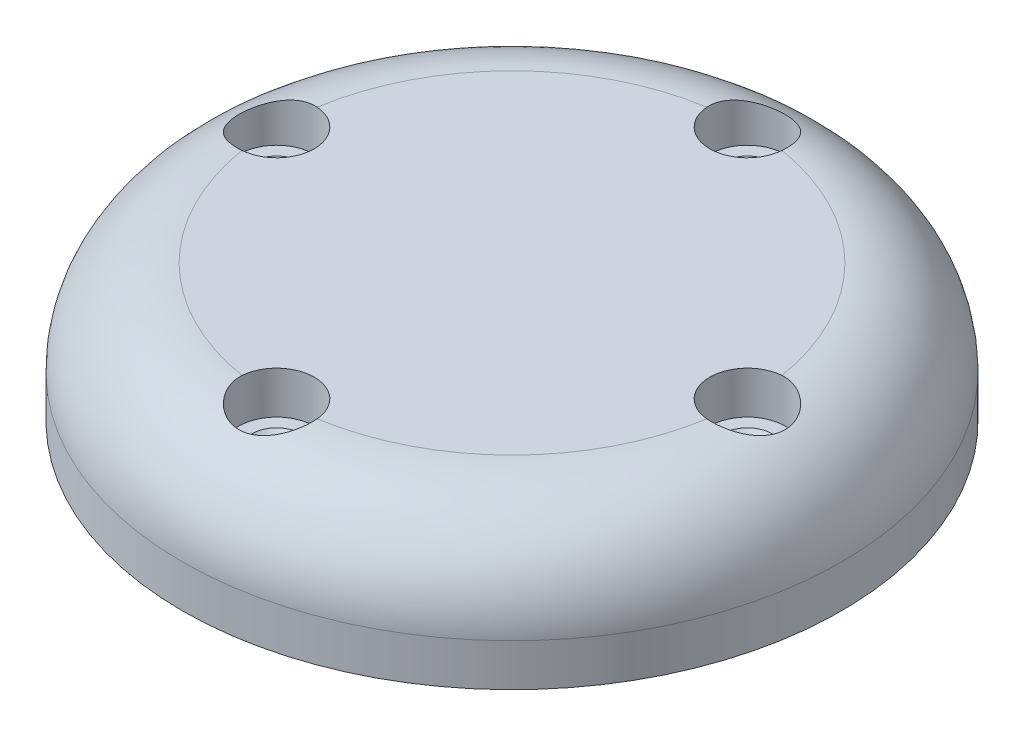
ISO-10303-21;
HEADER;
FILE_DESCRIPTION(('STEP AP214'),'2;1');
FILE_NAME('part.step','',(''),(''),'','','');
FILE_SCHEMA(('AUTOMOTIVE_DESIGN { 1 0 10303 214 1 1 1 1 }'));
ENDSEC;
DATA;
#1=APPLICATION_CONTEXT('core data for automotive mechanical design processes');
#2=APPLICATION_PROTOCOL_DEFINITION('international standard','automotive_design',2000,#1);
#3=PRODUCT_CONTEXT('',#1,'mechanical');
#4=PRODUCT('Part','Part','',(#3));
#5=PRODUCT_RELATED_PRODUCT_CATEGORY('part','',(#4));
#6=PRODUCT_DEFINITION_FORMATION('','',#4);
#7=PRODUCT_DEFINITION_CONTEXT('part definition',#1,'design');
#8=PRODUCT_DEFINITION('design','',#6,#7);
#9=PRODUCT_DEFINITION_SHAPE('','',#8);
#10=(LENGTH_UNIT() NAMED_UNIT(*) SI_UNIT(.MILLI.,.METRE.));
#11=(NAMED_UNIT(*) PLANE_ANGLE_UNIT() SI_UNIT($,.RADIAN.));
#12=(NAMED_UNIT(*) SI_UNIT($,.STERADIAN.) SOLID_ANGLE_UNIT());
#13=UNCERTAINTY_MEASURE_WITH_UNIT(LENGTH_MEASURE(1.E-05),#10,'distance_accuracy_value','');
#14=(GEOMETRIC_REPRESENTATION_CONTEXT(3) GLOBAL_UNCERTAINTY_ASSIGNED_CONTEXT((#13)) GLOBAL_UNIT_ASSIGNED_CONTEXT((#10,
#11,#12)) REPRESENTATION_CONTEXT('',''));
#15=CARTESIAN_POINT('',(0.,0.,0.));
#16=DIRECTION('',(0.,0.,1.));
#17=DIRECTION('',(1.,0.,0.));
#18=AXIS2_PLACEMENT_3D('',#15,#16,#17);
#19=CARTESIAN_POINT('',(0.,7.84,0.));
#20=DIRECTION('',(0.,-1.,0.));
#21=DIRECTION('',(0.,0.,-1.));
#22=AXIS2_PLACEMENT_3D('',#19,#20,#21);
#23=CYLINDRICAL_SURFACE('',#22,13.);
#24=CARTESIAN_POINT('',(0.,7.84,0.));
#25=DIRECTION('',(0.,1.,0.));
#26=DIRECTION('',(0.,0.,1.));
#27=AXIS2_PLACEMENT_3D('',#24,#25,#26);
#28=CIRCLE('',#27,13.);
#29=CARTESIAN_POINT('',(0.,7.84,-13.));
#30=VERTEX_POINT('',#29);
#31=EDGE_CURVE('E225',#30,#30,#28,.T.);
#32=CARTESIAN_POINT('',(0.,6.5,0.));
#33=DIRECTION('',(0.,-1.,0.));
#34=DIRECTION('',(0.,0.,-1.));
#35=AXIS2_PLACEMENT_3D('',#32,#33,#34);
#36=CIRCLE('',#35,13.);
#37=CARTESIAN_POINT('',(0.,6.5,-13.));
#38=VERTEX_POINT('',#37);
#39=EDGE_CURVE('E228',#38,#38,#36,.T.);
#40=CARTESIAN_POINT('',(0.,7.84,-13.));
#41=CARTESIAN_POINT('',(0.,7.82604166666667,-13.));
#42=CARTESIAN_POINT('',(0.,7.81208333333333,-13.));
#43=CARTESIAN_POINT('',(0.,7.78416666666667,-13.));
#44=CARTESIAN_POINT('',(0.,7.77020833333333,-13.));
#45=CARTESIAN_POINT('',(0.,7.74229166666667,-13.));
#46=CARTESIAN_POINT('',(0.,7.72833333333333,-13.));
#47=CARTESIAN_POINT('',(0.,7.70041666666667,-13.));
#48=CARTESIAN_POINT('',(0.,7.68645833333333,-13.));
#49=CARTESIAN_POINT('',(0.,7.65854166666667,-13.));
#50=CARTESIAN_POINT('',(0.,7.64458333333333,-13.));
#51=CARTESIAN_POINT('',(0.,7.61666666666667,-13.));
#52=CARTESIAN_POINT('',(0.,7.60270833333333,-13.));
#53=CARTESIAN_POINT('',(0.,7.57479166666667,-13.));
#54=CARTESIAN_POINT('',(0.,7.56083333333333,-13.));
#55=CARTESIAN_POINT('',(0.,7.53291666666667,-13.));
#56=CARTESIAN_POINT('',(0.,7.51895833333333,-13.));
#57=CARTESIAN_POINT('',(0.,7.49104166666667,-13.));
#58=CARTESIAN_POINT('',(0.,7.47708333333333,-13.));
#59=CARTESIAN_POINT('',(0.,7.44916666666667,-13.));
#60=CARTESIAN_POINT('',(0.,7.43520833333333,-13.));
#61=CARTESIAN_POINT('',(0.,7.40729166666667,-13.));
#62=CARTESIAN_POINT('',(0.,7.39333333333333,-13.));
#63=CARTESIAN_POINT('',(0.,7.36541666666667,-13.));
#64=CARTESIAN_POINT('',(0.,7.35145833333333,-13.));
#65=CARTESIAN_POINT('',(0.,7.32354166666667,-13.));
#66=CARTESIAN_POINT('',(0.,7.30958333333333,-13.));
#67=CARTESIAN_POINT('',(0.,7.28166666666667,-13.));
#68=CARTESIAN_POINT('',(0.,7.26770833333333,-13.));
#69=CARTESIAN_POINT('',(0.,7.23979166666667,-13.));
#70=CARTESIAN_POINT('',(0.,7.22583333333333,-13.));
#71=CARTESIAN_POINT('',(0.,7.19791666666667,-13.));
#72=CARTESIAN_POINT('',(0.,7.18395833333333,-13.));
#73=CARTESIAN_POINT('',(0.,7.15604166666667,-13.));
#74=CARTESIAN_POINT('',(0.,7.14208333333333,-13.));
#75=CARTESIAN_POINT('',(0.,7.11416666666667,-13.));
#76=CARTESIAN_POINT('',(0.,7.10020833333333,-13.));
#77=CARTESIAN_POINT('',(0.,7.07229166666667,-13.));
#78=CARTESIAN_POINT('',(0.,7.05833333333333,-13.));
#79=CARTESIAN_POINT('',(0.,7.03041666666667,-13.));
#80=CARTESIAN_POINT('',(0.,7.01645833333333,-13.));
#81=CARTESIAN_POINT('',(0.,6.98854166666667,-13.));
#82=CARTESIAN_POINT('',(0.,6.97458333333333,-13.));
#83=CARTESIAN_POINT('',(0.,6.94666666666667,-13.));
#84=CARTESIAN_POINT('',(0.,6.93270833333333,-13.));
#85=CARTESIAN_POINT('',(0.,6.90479166666667,-13.));
#86=CARTESIAN_POINT('',(0.,6.89083333333333,-13.));
#87=CARTESIAN_POINT('',(0.,6.86291666666667,-13.));
#88=CARTESIAN_POINT('',(0.,6.84895833333333,-13.));
#89=CARTESIAN_POINT('',(0.,6.82104166666667,-13.));
#90=CARTESIAN_POINT('',(0.,6.80708333333333,-13.));
#91=CARTESIAN_POINT('',(0.,6.77916666666667,-13.));
#92=CARTESIAN_POINT('',(0.,6.76520833333333,-13.));
#93=CARTESIAN_POINT('',(0.,6.73729166666667,-13.));
#94=CARTESIAN_POINT('',(0.,6.72333333333333,-13.));
#95=CARTESIAN_POINT('',(0.,6.69541666666667,-13.));
#96=CARTESIAN_POINT('',(0.,6.68145833333333,-13.));
#97=CARTESIAN_POINT('',(0.,6.65354166666667,-13.));
#98=CARTESIAN_POINT('',(0.,6.63958333333333,-13.));
#99=CARTESIAN_POINT('',(0.,6.61166666666667,-13.));
#100=CARTESIAN_POINT('',(0.,6.59770833333334,-13.));
#101=CARTESIAN_POINT('',(0.,6.56979166666667,-13.));
#102=CARTESIAN_POINT('',(0.,6.55583333333333,-13.));
#103=CARTESIAN_POINT('',(0.,6.52791666666667,-13.));
#104=CARTESIAN_POINT('',(0.,6.51395833333333,-13.));
#105=CARTESIAN_POINT('',(0.,6.5,-13.));
#106=B_SPLINE_CURVE_WITH_KNOTS('',3,(#40,#41,#42,#43,#44,#45,#46,#47,#48,#49,#50,#51,#52,#53,
#54,#55,#56,#57,#58,#59,#60,#61,#62,#63,#64,#65,#66,#67,#68,#69,#70,#71,#72,#73,#74,#75,#76,#77,
#78,#79,#80,#81,#82,#83,#84,#85,#86,#87,#88,#89,#90,#91,#92,#93,#94,#95,#96,#97,#98,#99,#100,
#101,#102,#103,#104,#105),.UNSPECIFIED.,.F.,.F.,(4,2,2,2,2,2,2,2,2,2,2,2,2,2,2,2,2,2,2,2,2,2,2,
2,2,2,2,2,2,2,2,2,4),(0.,0.0418750000000011,0.0837500000000005,0.125625000000001,
0.167500000000001,0.209375,0.251250000000001,0.293125,0.335,0.376875,0.41875,0.460625,0.5025,
0.544375,0.58625,0.628125,0.67,0.711875,0.753749999999999,0.795624999999999,0.8375,
0.879374999999999,0.921249999999999,0.963125,1.005,1.046875,1.08875,1.130625,1.1725,1.214375,
1.25625,1.298125,1.34),.UNSPECIFIED.);
#107=EDGE_CURVE('BSEAM47',#30,#38,#106,.T.);
#108=ORIENTED_EDGE('',*,*,#31,.T.);
#109=ORIENTED_EDGE('',*,*,#39,.T.);
#110=ORIENTED_EDGE('',*,*,#107,.T.);
#111=ORIENTED_EDGE('',*,*,#107,.F.);
#112=EDGE_LOOP('',(#108,#110,#109,#111));
#113=FACE_BOUND('',#112,.T.);
#114=ADVANCED_FACE('F47',(#113),#23,.F.);
#115=CARTESIAN_POINT('',(0.,21.,0.));
#116=DIRECTION('',(0.,-1.,0.));
#117=DIRECTION('',(0.,0.,-1.));
#118=AXIS2_PLACEMENT_3D('',#115,#116,#117);
#119=CYLINDRICAL_SURFACE('',#118,14.);
#120=CARTESIAN_POINT('',(0.,7.84,0.));
#121=DIRECTION('',(0.,1.,0.));
#122=DIRECTION('',(0.,0.,1.));
#123=AXIS2_PLACEMENT_3D('',#120,#121,#122);
#124=CIRCLE('',#123,14.);
#125=CARTESIAN_POINT('',(0.,7.84,14.));
#126=VERTEX_POINT('',#125);
#127=EDGE_CURVE('E114',#126,#126,#124,.T.);
#128=ORIENTED_EDGE('',*,*,#127,.F.);
#129=EDGE_LOOP('',(#128));
#130=FACE_BOUND('',#129,.T.);
#131=CARTESIAN_POINT('',(0.,9.,0.));
#132=DIRECTION('',(0.,1.,0.));
#133=DIRECTION('',(0.,0.,1.));
#134=AXIS2_PLACEMENT_3D('',#131,#132,#133);
#135=CIRCLE('',#134,14.);
#136=CARTESIAN_POINT('',(0.,9.,14.));
#137=VERTEX_POINT('',#136);
#138=EDGE_CURVE('E241',#137,#137,#135,.T.);
#139=ORIENTED_EDGE('',*,*,#138,.T.);
#140=EDGE_LOOP('',(#139));
#141=FACE_BOUND('',#140,.T.);
#142=ADVANCED_FACE('F196',(#130,#141),#119,.F.);
#143=CARTESIAN_POINT('',(0.,57.5979797464467,0.));
#144=DIRECTION('',(0.,-1.,0.));
#145=DIRECTION('',(0.,0.,-1.));
#146=AXIS2_PLACEMENT_3D('',#143,#144,#145);
#147=CYLINDRICAL_SURFACE('',#146,13.);
#148=CARTESIAN_POINT('',(0.,17.,0.));
#149=DIRECTION('',(0.,-1.,0.));
#150=DIRECTION('',(0.,0.,-1.));
#151=AXIS2_PLACEMENT_3D('',#148,#149,#150);
#152=CIRCLE('',#151,13.);
#153=CARTESIAN_POINT('',(0.,17.,-13.));
#154=VERTEX_POINT('',#153);
#155=EDGE_CURVE('E107',#154,#154,#152,.T.);
#156=ORIENTED_EDGE('',*,*,#155,.F.);
#157=EDGE_LOOP('',(#156));
#158=FACE_BOUND('',#157,.T.);
#159=CARTESIAN_POINT('',(0.,9.,0.));
#160=DIRECTION('',(0.,1.,0.));
#161=DIRECTION('',(0.,0.,1.));
#162=AXIS2_PLACEMENT_3D('',#159,#160,#161);
#163=CIRCLE('',#162,13.);
#164=CARTESIAN_POINT('',(0.,9.,13.));
#165=VERTEX_POINT('',#164);
#166=EDGE_CURVE('E264',#165,#165,#163,.T.);
#167=ORIENTED_EDGE('',*,*,#166,.F.);
#168=EDGE_LOOP('',(#167));
#169=FACE_BOUND('',#168,.T.);
#170=ADVANCED_FACE('F202',(#158,#169),#147,.F.);
#171=CARTESIAN_POINT('',(0.,9.,0.));
#172=DIRECTION('',(0.,1.,0.));
#173=DIRECTION('',(0.,0.,1.));
#174=AXIS2_PLACEMENT_3D('',#171,#172,#173);
#175=PLANE('',#174);
#176=ORIENTED_EDGE('',*,*,#166,.T.);
#177=EDGE_LOOP('',(#176));
#178=FACE_BOUND('',#177,.T.);
#179=ORIENTED_EDGE('',*,*,#138,.F.);
#180=EDGE_LOOP('',(#179));
#181=FACE_BOUND('',#180,.T.);
#182=ADVANCED_FACE('F212',(#178,#181),#175,.F.);
#183=CARTESIAN_POINT('',(0.,7.84,0.));
#184=DIRECTION('',(0.,1.,0.));
#185=DIRECTION('',(0.,0.,1.));
#186=AXIS2_PLACEMENT_3D('',#183,#184,#185);
#187=PLANE('',#186);
#188=ORIENTED_EDGE('',*,*,#127,.T.);
#189=EDGE_LOOP('',(#188));
#190=FACE_BOUND('',#189,.T.);
#191=ORIENTED_EDGE('',*,*,#31,.F.);
#192=EDGE_LOOP('',(#191));
#193=FACE_BOUND('',#192,.T.);
#194=ADVANCED_FACE('F210',(#190,#193),#187,.T.);
#195=CARTESIAN_POINT('',(0.,17.,0.));
#196=DIRECTION('',(0.,-1.,0.));
#197=DIRECTION('',(0.,0.,-1.));
#198=AXIS2_PLACEMENT_3D('',#195,#196,#197);
#199=PLANE('',#198);
#200=ORIENTED_EDGE('',*,*,#155,.T.);
#201=EDGE_LOOP('',(#200));
#202=FACE_BOUND('',#201,.T.);
#203=ADVANCED_FACE('F208',(#202),#199,.T.);
#204=CARTESIAN_POINT('',(0.,6.5,0.));
#205=DIRECTION('',(0.,-1.,0.));
#206=DIRECTION('',(0.,0.,-1.));
#207=AXIS2_PLACEMENT_3D('',#204,#205,#206);
#208=PLANE('',#207);
#209=ORIENTED_EDGE('',*,*,#39,.F.);
#210=EDGE_LOOP('',(#209));
#211=FACE_BOUND('',#210,.T.);
#212=CARTESIAN_POINT('',(0.,6.5,0.));
#213=DIRECTION('',(0.,-1.,0.));
#214=DIRECTION('',(0.,0.,-1.));
#215=AXIS2_PLACEMENT_3D('',#212,#213,#214);
#216=CIRCLE('',#215,35.);
#217=CARTESIAN_POINT('',(0.,6.5,-35.));
#218=VERTEX_POINT('',#217);
#219=EDGE_CURVE('E326',#218,#218,#216,.T.);
#220=ORIENTED_EDGE('',*,*,#219,.T.);
#221=EDGE_LOOP('',(#220));
#222=FACE_BOUND('',#221,.T.);
#223=CARTESIAN_POINT('',(0.,6.5,25.));
#224=DIRECTION('',(0.,-1.,0.));
#225=DIRECTION('',(0.,0.,-1.));
#226=AXIS2_PLACEMENT_3D('',#223,#224,#225);
#227=CIRCLE('',#226,2.1);
#228=CARTESIAN_POINT('',(0.,6.5,22.9));
#229=VERTEX_POINT('',#228);
#230=EDGE_CURVE('E117',#229,#229,#227,.F.);
#231=ORIENTED_EDGE('',*,*,#230,.T.);
#232=EDGE_LOOP('',(#231));
#233=FACE_BOUND('',#232,.T.);
#234=CARTESIAN_POINT('',(-25.,6.5,0.));
#235=DIRECTION('',(0.,-1.,0.));
#236=DIRECTION('',(0.,0.,-1.));
#237=AXIS2_PLACEMENT_3D('',#234,#235,#236);
#238=CIRCLE('',#237,2.1);
#239=CARTESIAN_POINT('',(-25.,6.5,-2.1));
#240=VERTEX_POINT('',#239);
#241=EDGE_CURVE('E320',#240,#240,#238,.F.);
#242=ORIENTED_EDGE('',*,*,#241,.T.);
#243=EDGE_LOOP('',(#242));
#244=FACE_BOUND('',#243,.T.);
#245=CARTESIAN_POINT('',(25.,6.5,0.));
#246=DIRECTION('',(0.,-1.,0.));
#247=DIRECTION('',(0.,0.,-1.));
#248=AXIS2_PLACEMENT_3D('',#245,#246,#247);
#249=CIRCLE('',#248,2.1);
#250=CARTESIAN_POINT('',(25.,6.5,-2.1));
#251=VERTEX_POINT('',#250);
#252=EDGE_CURVE('E317',#251,#251,#249,.F.);
#253=ORIENTED_EDGE('',*,*,#252,.T.);
#254=EDGE_LOOP('',(#253));
#255=FACE_BOUND('',#254,.T.);
#256=CARTESIAN_POINT('',(0.,6.5,-25.));
#257=DIRECTION('',(0.,-1.,0.));
#258=DIRECTION('',(0.,0.,-1.));
#259=AXIS2_PLACEMENT_3D('',#256,#257,#258);
#260=CIRCLE('',#259,2.1);
#261=CARTESIAN_POINT('',(0.,6.5,-27.1));
#262=VERTEX_POINT('',#261);
#263=EDGE_CURVE('E235',#262,#262,#260,.F.);
#264=ORIENTED_EDGE('',*,*,#263,.T.);
#265=EDGE_LOOP('',(#264));
#266=FACE_BOUND('',#265,.T.);
#267=ADVANCED_FACE('F151',(#211,#222,#233,#244,#255,#266),#208,.T.);
#268=CARTESIAN_POINT('',(25.,16.5,0.));
#269=DIRECTION('',(0.,1.,0.));
#270=DIRECTION('',(0.,0.,1.));
#271=AXIS2_PLACEMENT_3D('',#268,#269,#270);
#272=PLANE('',#271);
#273=CARTESIAN_POINT('',(25.,16.5,0.));
#274=DIRECTION('',(0.,1.,0.));
#275=DIRECTION('',(0.,0.,1.));
#276=AXIS2_PLACEMENT_3D('',#273,#274,#275);
#277=CIRCLE('',#276,2.6);
#278=CARTESIAN_POINT('',(25.,16.5,2.6));
#279=VERTEX_POINT('',#278);
#280=EDGE_CURVE('E272',#279,#279,#277,.F.);
#281=ORIENTED_EDGE('',*,*,#280,.T.);
#282=EDGE_LOOP('',(#281));
#283=FACE_BOUND('',#282,.T.);
#284=CARTESIAN_POINT('',(25.,16.5,0.));
#285=DIRECTION('',(0.,1.,0.));
#286=DIRECTION('',(0.,0.,1.));
#287=AXIS2_PLACEMENT_3D('',#284,#285,#286);
#288=CIRCLE('',#287,4.);
#289=CARTESIAN_POINT('',(25.,16.5,4.));
#290=VERTEX_POINT('',#289);
#291=EDGE_CURVE('E232',#290,#290,#288,.T.);
#292=ORIENTED_EDGE('',*,*,#291,.T.);
#293=EDGE_LOOP('',(#292));
#294=FACE_BOUND('',#293,.T.);
#295=ADVANCED_FACE('F147',(#283,#294),#272,.T.);
#296=CARTESIAN_POINT('',(25.,16.,0.));
#297=DIRECTION('',(0.,1.,0.));
#298=DIRECTION('',(0.,0.,1.));
#299=AXIS2_PLACEMENT_3D('',#296,#297,#298);
#300=CONICAL_SURFACE('',#299,2.1,0.785398163397456);
#301=ORIENTED_EDGE('',*,*,#280,.F.);
#302=EDGE_LOOP('',(#301));
#303=FACE_BOUND('',#302,.T.);
#304=CARTESIAN_POINT('',(25.,16.,0.));
#305=DIRECTION('',(0.,1.,0.));
#306=DIRECTION('',(0.,0.,1.));
#307=AXIS2_PLACEMENT_3D('',#304,#305,#306);
#308=CIRCLE('',#307,2.1);
#309=CARTESIAN_POINT('',(25.,16.,2.1));
#310=VERTEX_POINT('',#309);
#311=EDGE_CURVE('E268',#310,#310,#308,.T.);
#312=ORIENTED_EDGE('',*,*,#311,.F.);
#313=EDGE_LOOP('',(#312));
#314=FACE_BOUND('',#313,.T.);
#315=ADVANCED_FACE('F150',(#303,#314),#300,.F.);
#316=CARTESIAN_POINT('',(25.,2.999,0.));
#317=DIRECTION('',(0.,1.,0.));
#318=DIRECTION('',(0.,0.,1.));
#319=AXIS2_PLACEMENT_3D('',#316,#317,#318);
#320=CYLINDRICAL_SURFACE('',#319,2.1);
#321=ORIENTED_EDGE('',*,*,#311,.T.);
#322=EDGE_LOOP('',(#321));
#323=FACE_BOUND('',#322,.T.);
#324=ORIENTED_EDGE('',*,*,#252,.F.);
#325=EDGE_LOOP('',(#324));
#326=FACE_BOUND('',#325,.T.);
#327=ADVANCED_FACE('F157',(#323,#326),#320,.F.);
#328=CARTESIAN_POINT('',(25.,16.5,0.));
#329=DIRECTION('',(0.,1.,0.));
#330=DIRECTION('',(0.,0.,1.));
#331=AXIS2_PLACEMENT_3D('',#328,#329,#330);
#332=CYLINDRICAL_SURFACE('',#331,4.);
#333=ORIENTED_EDGE('',*,*,#291,.F.);
#334=EDGE_LOOP('',(#333));
#335=FACE_BOUND('',#334,.T.);
#336=CARTESIAN_POINT('',(25.,21.,0.));
#337=DIRECTION('',(0.,1.,0.));
#338=DIRECTION('',(0.,0.,1.));
#339=AXIS2_PLACEMENT_3D('',#336,#337,#338);
#340=CIRCLE('',#339,4.);
#341=CARTESIAN_POINT('',(24.68,21.,-3.98717945420068));
#342=VERTEX_POINT('',#341);
#343=CARTESIAN_POINT('',(24.68,21.,3.98717945420067));
#344=VERTEX_POINT('',#343);
#345=EDGE_CURVE('E227',#342,#344,#340,.T.);
#346=ORIENTED_EDGE('',*,*,#345,.T.);
#347=CARTESIAN_POINT('',(24.68,21.,3.98717945420067));
#348=CARTESIAN_POINT('',(24.7880505663801,21.0000144425795,3.99586625769275));
#349=CARTESIAN_POINT('',(24.8964439847917,20.9982489281105,4.00013044209167));
#350=CARTESIAN_POINT('',(25.1130793322315,20.9913361734222,3.99986389085369));
#351=CARTESIAN_POINT('',(25.2213212982499,20.9861899996933,3.99533592797883));
#352=CARTESIAN_POINT('',(25.4365429742421,20.9727153577538,3.977569106737));
#353=CARTESIAN_POINT('',(25.5435256034908,20.9643970606451,3.96435799308082));
#354=CARTESIAN_POINT('',(25.7557966627533,20.9448519048129,3.92942194114383));
#355=CARTESIAN_POINT('',(25.8610850096702,20.9336249038898,3.9076965865955));
#356=CARTESIAN_POINT('',(26.1731643963577,20.8960604741558,3.830079732015));
#357=CARTESIAN_POINT('',(26.3765331587805,20.8658151997149,3.76171665237753));
#358=CARTESIAN_POINT('',(26.7687243870281,20.797950174476,3.59405353960759));
#359=CARTESIAN_POINT('',(26.9575370942022,20.7603255352893,3.49473297314917));
#360=CARTESIAN_POINT('',(27.3237591143884,20.6794953842005,3.26326778423462));
#361=CARTESIAN_POINT('',(27.5003952312905,20.6361254035987,3.12995515969168));
#362=CARTESIAN_POINT('',(27.8293272802009,20.5490889231616,2.8361204321972));
#363=CARTESIAN_POINT('',(27.9816165961151,20.5054223460772,2.67559095756984));
#364=CARTESIAN_POINT('',(28.2633236357599,20.4202519619586,2.32448794978826));
#365=CARTESIAN_POINT('',(28.3916611254736,20.3788919968538,2.1330091172527));
#366=CARTESIAN_POINT('',(28.6140712539184,20.3045543246724,1.72959542453077));
#367=CARTESIAN_POINT('',(28.7081528061754,20.2715744377432,1.51766590387419));
#368=CARTESIAN_POINT('',(28.8562972491204,20.2185650806905,1.08601345004041));
#369=CARTESIAN_POINT('',(28.9114947501854,20.1981708044247,0.866726307255782));
#370=CARTESIAN_POINT('',(28.9841548790673,20.1711603882536,0.421185557866261));
#371=CARTESIAN_POINT('',(29.001633115272,20.1645385492979,0.194934872129907));
#372=CARTESIAN_POINT('',(28.9982241635199,20.1658180169302,-0.244366046610519));
#373=CARTESIAN_POINT('',(28.9794527219457,20.1729184300527,-0.457438530278392));
#374=CARTESIAN_POINT('',(28.9084450259099,20.1992935605444,-0.877128485411066));
#375=CARTESIAN_POINT('',(28.8562088751961,20.2185682401709,-1.08374597688564));
#376=CARTESIAN_POINT('',(28.7203136689209,20.2672492544243,-1.48458153962825));
#377=CARTESIAN_POINT('',(28.6367171927534,20.2966354020582,-1.67882340929855));
#378=CARTESIAN_POINT('',(28.4407003185759,20.3627420358639,-2.05080946666296));
#379=CARTESIAN_POINT('',(28.3282715230394,20.3994646581231,-2.22854882735939));
#380=CARTESIAN_POINT('',(28.0707058446778,20.4791116248704,-2.57282765871987));
#381=CARTESIAN_POINT('',(27.9241238409814,20.5222645077937,-2.73823406877573));
#382=CARTESIAN_POINT('',(27.6058829435702,20.6091199187118,-3.04268497566212));
#383=CARTESIAN_POINT('',(27.4342166977854,20.6528226044071,-3.18172171612099));
#384=CARTESIAN_POINT('',(27.0624373307713,20.7384326489487,-3.43493673253703));
#385=CARTESIAN_POINT('',(26.8614724068124,20.7802023103006,-3.5479257748188));
#386=CARTESIAN_POINT('',(26.5470581036859,20.8367511457039,-3.69051653998467));
#387=CARTESIAN_POINT('',(26.4400634143723,20.8545868947993,-3.73357216456909));
#388=CARTESIAN_POINT('',(26.2224227185795,20.8877402710213,-3.81037690832207));
#389=CARTESIAN_POINT('',(26.1117784482186,20.9030590753012,-3.84413038305748));
#390=CARTESIAN_POINT('',(25.892986429544,20.9300559039251,-3.90060638729445));
#391=CARTESIAN_POINT('',(25.7849713249066,20.9418727333344,-3.92377827453167));
#392=CARTESIAN_POINT('',(25.5671147432869,20.9624544754577,-3.96113537524594));
#393=CARTESIAN_POINT('',(25.4572734401062,20.9712196768762,-3.97532143894652));
#394=CARTESIAN_POINT('',(25.2362305875312,20.9854250383886,-3.99456263918084));
#395=CARTESIAN_POINT('',(25.125025864693,20.9908547454633,-3.99958916667938));
#396=CARTESIAN_POINT('',(24.9024260476492,20.9981511701044,-4.00036373466694));
#397=CARTESIAN_POINT('',(24.7910308965611,21.0000165126283,-3.99610819572239));
#398=CARTESIAN_POINT('',(24.68,21.,-3.98717945420068));
#399=B_SPLINE_CURVE_WITH_KNOTS('',3,(#347,#348,#349,#350,#351,#352,#353,#354,#355,#356,#357,
#358,#359,#360,#361,#362,#363,#364,#365,#366,#367,#368,#369,#370,#371,#372,#373,#374,#375,#376,
#377,#378,#379,#380,#381,#382,#383,#384,#385,#386,#387,#388,#389,#390,#391,#392,#393,#394,#395,
#396,#397,#398),.UNSPECIFIED.,.F.,.F.,(4,2,2,2,2,2,2,2,2,2,2,2,2,2,2,2,2,2,2,2,2,2,2,2,2,4),(0.,
0.325073292238734,0.650044083408135,0.973981531619185,1.29793481934688,1.94475866110898,
2.59201244117569,3.26552019326124,3.93921065699629,4.6383292038961,5.33726570725271,
6.01485282459463,6.69215949977869,7.3311258528084,7.97009022491576,8.6077862708131,
9.24566825955278,9.9182048845121,10.590939023561,11.2900656430563,11.6398063185588,
11.9893829548755,12.3222856542598,12.6551568502427,12.9890659706933,13.3231038789335),.UNSPECIFIED.);
#400=EDGE_CURVE('E57',#344,#342,#399,.T.);
#401=ORIENTED_EDGE('',*,*,#400,.T.);
#402=EDGE_LOOP('',(#346,#401));
#403=FACE_BOUND('',#402,.T.);
#404=ADVANCED_FACE('F153',(#335,#403),#332,.F.);
#405=CARTESIAN_POINT('',(0.,16.5,-25.));
#406=DIRECTION('',(0.,1.,0.));
#407=DIRECTION('',(0.,0.,1.));
#408=AXIS2_PLACEMENT_3D('',#405,#406,#407);
#409=PLANE('',#408);
#410=CARTESIAN_POINT('',(0.,16.5,-25.));
#411=DIRECTION('',(0.,1.,0.));
#412=DIRECTION('',(0.,0.,1.));
#413=AXIS2_PLACEMENT_3D('',#410,#411,#412);
#414=CIRCLE('',#413,2.6);
#415=CARTESIAN_POINT('',(0.,16.5,-22.4));
#416=VERTEX_POINT('',#415);
#417=EDGE_CURVE('E296',#416,#416,#414,.F.);
#418=ORIENTED_EDGE('',*,*,#417,.T.);
#419=EDGE_LOOP('',(#418));
#420=FACE_BOUND('',#419,.T.);
#421=CARTESIAN_POINT('',(0.,16.5,-25.));
#422=DIRECTION('',(0.,1.,0.));
#423=DIRECTION('',(0.,0.,1.));
#424=AXIS2_PLACEMENT_3D('',#421,#422,#423);
#425=CIRCLE('',#424,4.);
#426=CARTESIAN_POINT('',(0.,16.5,-21.));
#427=VERTEX_POINT('',#426);
#428=EDGE_CURVE('E250',#427,#427,#425,.T.);
#429=ORIENTED_EDGE('',*,*,#428,.T.);
#430=EDGE_LOOP('',(#429));
#431=FACE_BOUND('',#430,.T.);
#432=ADVANCED_FACE('F146',(#420,#431),#409,.T.);
#433=CARTESIAN_POINT('',(0.,16.,-25.));
#434=DIRECTION('',(0.,1.,0.));
#435=DIRECTION('',(0.,0.,1.));
#436=AXIS2_PLACEMENT_3D('',#433,#434,#435);
#437=CONICAL_SURFACE('',#436,2.1,0.785398163397456);
#438=ORIENTED_EDGE('',*,*,#417,.F.);
#439=EDGE_LOOP('',(#438));
#440=FACE_BOUND('',#439,.T.);
#441=CARTESIAN_POINT('',(0.,16.,-25.));
#442=DIRECTION('',(0.,1.,0.));
#443=DIRECTION('',(0.,0.,1.));
#444=AXIS2_PLACEMENT_3D('',#441,#442,#443);
#445=CIRCLE('',#444,2.1);
#446=CARTESIAN_POINT('',(0.,16.,-22.9));
#447=VERTEX_POINT('',#446);
#448=EDGE_CURVE('E292',#447,#447,#445,.T.);
#449=ORIENTED_EDGE('',*,*,#448,.F.);
#450=EDGE_LOOP('',(#449));
#451=FACE_BOUND('',#450,.T.);
#452=ADVANCED_FACE('F305',(#440,#451),#437,.F.);
#453=CARTESIAN_POINT('',(0.,2.999,-25.));
#454=DIRECTION('',(0.,1.,0.));
#455=DIRECTION('',(0.,0.,1.));
#456=AXIS2_PLACEMENT_3D('',#453,#454,#455);
#457=CYLINDRICAL_SURFACE('',#456,2.1);
#458=ORIENTED_EDGE('',*,*,#448,.T.);
#459=EDGE_LOOP('',(#458));
#460=FACE_BOUND('',#459,.T.);
#461=ORIENTED_EDGE('',*,*,#263,.F.);
#462=EDGE_LOOP('',(#461));
#463=FACE_BOUND('',#462,.T.);
#464=ADVANCED_FACE('F144',(#460,#463),#457,.F.);
#465=CARTESIAN_POINT('',(0.,16.5,-25.));
#466=DIRECTION('',(0.,1.,0.));
#467=DIRECTION('',(0.,0.,1.));
#468=AXIS2_PLACEMENT_3D('',#465,#466,#467);
#469=CYLINDRICAL_SURFACE('',#468,4.);
#470=ORIENTED_EDGE('',*,*,#428,.F.);
#471=EDGE_LOOP('',(#470));
#472=FACE_BOUND('',#471,.T.);
#473=CARTESIAN_POINT('',(0.,21.,-25.));
#474=DIRECTION('',(0.,1.,0.));
#475=DIRECTION('',(0.,0.,1.));
#476=AXIS2_PLACEMENT_3D('',#473,#474,#475);
#477=CIRCLE('',#476,4.);
#478=CARTESIAN_POINT('',(-3.98717945420068,21.,-24.68));
#479=VERTEX_POINT('',#478);
#480=CARTESIAN_POINT('',(3.98717945420068,21.,-24.68));
#481=VERTEX_POINT('',#480);
#482=EDGE_CURVE('E254',#479,#481,#477,.T.);
#483=ORIENTED_EDGE('',*,*,#482,.T.);
#484=CARTESIAN_POINT('',(3.98717945420068,21.,-24.68));
#485=CARTESIAN_POINT('',(3.99586625769275,21.0000144425795,-24.7880505663801));
#486=CARTESIAN_POINT('',(4.00013044209168,20.9982489281105,-24.8964439847917));
#487=CARTESIAN_POINT('',(3.99986389085369,20.9913361734222,-25.1130793322315));
#488=CARTESIAN_POINT('',(3.99533592797884,20.9861899996933,-25.2213212982499));
#489=CARTESIAN_POINT('',(3.97756910673701,20.9727153577538,-25.4365429742421));
#490=CARTESIAN_POINT('',(3.96435799308083,20.9643970606451,-25.5435256034908));
#491=CARTESIAN_POINT('',(3.92942194114383,20.9448519048129,-25.7557966627533));
#492=CARTESIAN_POINT('',(3.90769658659551,20.9336249038898,-25.8610850096702));
#493=CARTESIAN_POINT('',(3.83007973201501,20.8960604741558,-26.1731643963577));
#494=CARTESIAN_POINT('',(3.76171665237753,20.8658151997149,-26.3765331587805));
#495=CARTESIAN_POINT('',(3.5940535396076,20.7979501744761,-26.7687243870281));
#496=CARTESIAN_POINT('',(3.49473297314917,20.7603255352893,-26.9575370942022));
#497=CARTESIAN_POINT('',(3.26326778423463,20.6794953842005,-27.3237591143884));
#498=CARTESIAN_POINT('',(3.12995515969168,20.6361254035987,-27.5003952312905));
#499=CARTESIAN_POINT('',(2.8361204321972,20.5490889231616,-27.8293272802009));
#500=CARTESIAN_POINT('',(2.67559095756984,20.5054223460772,-27.9816165961151));
#501=CARTESIAN_POINT('',(2.32448794978826,20.4202519619586,-28.2633236357599));
#502=CARTESIAN_POINT('',(2.1330091172527,20.3788919968538,-28.3916611254736));
#503=CARTESIAN_POINT('',(1.72959542453077,20.3045543246724,-28.6140712539184));
#504=CARTESIAN_POINT('',(1.51766590387419,20.2715744377432,-28.7081528061754));
#505=CARTESIAN_POINT('',(1.08601345004041,20.2185650806905,-28.8562972491204));
#506=CARTESIAN_POINT('',(0.866726307255782,20.1981708044247,-28.9114947501854));
#507=CARTESIAN_POINT('',(0.421185557866261,20.1711603882536,-28.9841548790673));
#508=CARTESIAN_POINT('',(0.194934872129907,20.1645385492979,-29.0016331152719));
#509=CARTESIAN_POINT('',(-0.244366046610519,20.1658180169302,-28.9982241635199));
#510=CARTESIAN_POINT('',(-0.457438530278392,20.1729184300527,-28.9794527219456));
#511=CARTESIAN_POINT('',(-0.877128485411066,20.1992935605444,-28.9084450259099));
#512=CARTESIAN_POINT('',(-1.08374597688564,20.2185682401709,-28.8562088751961));
#513=CARTESIAN_POINT('',(-1.48458153962824,20.2672492544243,-28.7203136689209));
#514=CARTESIAN_POINT('',(-1.67882340929855,20.2966354020582,-28.6367171927534));
#515=CARTESIAN_POINT('',(-2.05080946666296,20.3627420358639,-28.4407003185759));
#516=CARTESIAN_POINT('',(-2.22854882735939,20.3994646581231,-28.3282715230394));
#517=CARTESIAN_POINT('',(-2.57282765871987,20.4791116248704,-28.0707058446778));
#518=CARTESIAN_POINT('',(-2.73823406877573,20.5222645077937,-27.9241238409814));
#519=CARTESIAN_POINT('',(-3.04268497566212,20.6091199187118,-27.6058829435702));
#520=CARTESIAN_POINT('',(-3.18172171612099,20.6528226044071,-27.4342166977854));
#521=CARTESIAN_POINT('',(-3.43493673253703,20.7384326489487,-27.0624373307712));
#522=CARTESIAN_POINT('',(-3.5479257748188,20.7802023103006,-26.8614724068124));
#523=CARTESIAN_POINT('',(-3.69051653998466,20.8367511457039,-26.5470581036859));
#524=CARTESIAN_POINT('',(-3.73357216456909,20.8545868947993,-26.4400634143723));
#525=CARTESIAN_POINT('',(-3.81037690832206,20.8877402710213,-26.2224227185795));
#526=CARTESIAN_POINT('',(-3.84413038305748,20.9030590753012,-26.1117784482186));
#527=CARTESIAN_POINT('',(-3.90060638729445,20.9300559039251,-25.892986429544));
#528=CARTESIAN_POINT('',(-3.92377827453167,20.9418727333344,-25.7849713249066));
#529=CARTESIAN_POINT('',(-3.96113537524593,20.9624544754577,-25.5671147432869));
#530=CARTESIAN_POINT('',(-3.97532143894651,20.9712196768762,-25.4572734401062));
#531=CARTESIAN_POINT('',(-3.99456263918084,20.9854250383886,-25.2362305875312));
#532=CARTESIAN_POINT('',(-3.99958916667938,20.9908547454633,-25.125025864693));
#533=CARTESIAN_POINT('',(-4.00036373466694,20.9981511701044,-24.9024260476492));
#534=CARTESIAN_POINT('',(-3.99610819572238,21.0000165126283,-24.7910308965611));
#535=CARTESIAN_POINT('',(-3.98717945420068,21.,-24.68));
#536=B_SPLINE_CURVE_WITH_KNOTS('',3,(#484,#485,#486,#487,#488,#489,#490,#491,#492,#493,#494,
#495,#496,#497,#498,#499,#500,#501,#502,#503,#504,#505,#506,#507,#508,#509,#510,#511,#512,#513,
#514,#515,#516,#517,#518,#519,#520,#521,#522,#523,#524,#525,#526,#527,#528,#529,#530,#531,#532,
#533,#534,#535),.UNSPECIFIED.,.F.,.F.,(4,2,2,2,2,2,2,2,2,2,2,2,2,2,2,2,2,2,2,2,2,2,2,2,2,4),(0.,
0.325073292238738,0.650044083408135,0.973981531619182,1.29793481934688,1.94475866110898,
2.59201244117569,3.26552019326124,3.9392106569963,4.63832920389611,5.33726570725271,
6.01485282459463,6.69215949977869,7.3311258528084,7.97009022491576,8.6077862708131,
9.24566825955278,9.91820488451209,10.590939023561,11.2900656430563,11.6398063185588,
11.9893829548755,12.3222856542598,12.6551568502427,12.9890659706933,13.3231038789335),.UNSPECIFIED.);
#537=EDGE_CURVE('E125',#481,#479,#536,.T.);
#538=ORIENTED_EDGE('',*,*,#537,.T.);
#539=EDGE_LOOP('',(#483,#538));
#540=FACE_BOUND('',#539,.T.);
#541=ADVANCED_FACE('F138',(#472,#540),#469,.F.);
#542=CARTESIAN_POINT('',(-25.,16.5,0.));
#543=DIRECTION('',(0.,1.,0.));
#544=DIRECTION('',(0.,0.,1.));
#545=AXIS2_PLACEMENT_3D('',#542,#543,#544);
#546=PLANE('',#545);
#547=CARTESIAN_POINT('',(-25.,16.5,0.));
#548=DIRECTION('',(0.,1.,0.));
#549=DIRECTION('',(0.,0.,1.));
#550=AXIS2_PLACEMENT_3D('',#547,#548,#549);
#551=CIRCLE('',#550,2.6);
#552=CARTESIAN_POINT('',(-25.,16.5,2.6));
#553=VERTEX_POINT('',#552);
#554=EDGE_CURVE('E288',#553,#553,#551,.F.);
#555=ORIENTED_EDGE('',*,*,#554,.T.);
#556=EDGE_LOOP('',(#555));
#557=FACE_BOUND('',#556,.T.);
#558=CARTESIAN_POINT('',(-25.,16.5,0.));
#559=DIRECTION('',(0.,1.,0.));
#560=DIRECTION('',(0.,0.,1.));
#561=AXIS2_PLACEMENT_3D('',#558,#559,#560);
#562=CIRCLE('',#561,4.);
#563=CARTESIAN_POINT('',(-25.,16.5,4.));
#564=VERTEX_POINT('',#563);
#565=EDGE_CURVE('E103',#564,#564,#562,.T.);
#566=ORIENTED_EDGE('',*,*,#565,.T.);
#567=EDGE_LOOP('',(#566));
#568=FACE_BOUND('',#567,.T.);
#569=ADVANCED_FACE('F143',(#557,#568),#546,.T.);
#570=CARTESIAN_POINT('',(-25.,16.,0.));
#571=DIRECTION('',(0.,1.,0.));
#572=DIRECTION('',(0.,0.,1.));
#573=AXIS2_PLACEMENT_3D('',#570,#571,#572);
#574=CONICAL_SURFACE('',#573,2.1,0.785398163397456);
#575=ORIENTED_EDGE('',*,*,#554,.F.);
#576=EDGE_LOOP('',(#575));
#577=FACE_BOUND('',#576,.T.);
#578=CARTESIAN_POINT('',(-25.,16.,0.));
#579=DIRECTION('',(0.,1.,0.));
#580=DIRECTION('',(0.,0.,1.));
#581=AXIS2_PLACEMENT_3D('',#578,#579,#580);
#582=CIRCLE('',#581,2.1);
#583=CARTESIAN_POINT('',(-25.,16.,2.1));
#584=VERTEX_POINT('',#583);
#585=EDGE_CURVE('E284',#584,#584,#582,.T.);
#586=ORIENTED_EDGE('',*,*,#585,.F.);
#587=EDGE_LOOP('',(#586));
#588=FACE_BOUND('',#587,.T.);
#589=ADVANCED_FACE('F179',(#577,#588),#574,.F.);
#590=CARTESIAN_POINT('',(-25.,2.999,0.));
#591=DIRECTION('',(0.,1.,0.));
#592=DIRECTION('',(0.,0.,1.));
#593=AXIS2_PLACEMENT_3D('',#590,#591,#592);
#594=CYLINDRICAL_SURFACE('',#593,2.1);
#595=ORIENTED_EDGE('',*,*,#585,.T.);
#596=EDGE_LOOP('',(#595));
#597=FACE_BOUND('',#596,.T.);
#598=ORIENTED_EDGE('',*,*,#241,.F.);
#599=EDGE_LOOP('',(#598));
#600=FACE_BOUND('',#599,.T.);
#601=ADVANCED_FACE('F184',(#597,#600),#594,.F.);
#602=CARTESIAN_POINT('',(-25.,16.5,0.));
#603=DIRECTION('',(0.,1.,0.));
#604=DIRECTION('',(0.,0.,1.));
#605=AXIS2_PLACEMENT_3D('',#602,#603,#604);
#606=CYLINDRICAL_SURFACE('',#605,4.);
#607=ORIENTED_EDGE('',*,*,#565,.F.);
#608=EDGE_LOOP('',(#607));
#609=FACE_BOUND('',#608,.T.);
#610=CARTESIAN_POINT('',(-25.,21.,0.));
#611=DIRECTION('',(0.,1.,0.));
#612=DIRECTION('',(0.,0.,1.));
#613=AXIS2_PLACEMENT_3D('',#610,#611,#612);
#614=CIRCLE('',#613,4.);
#615=CARTESIAN_POINT('',(-24.68,21.,3.98717945420068));
#616=VERTEX_POINT('',#615);
#617=CARTESIAN_POINT('',(-24.68,21.,-3.98717945420068));
#618=VERTEX_POINT('',#617);
#619=EDGE_CURVE('E246',#616,#618,#614,.T.);
#620=ORIENTED_EDGE('',*,*,#619,.T.);
#621=CARTESIAN_POINT('',(-24.68,21.,-3.98717945420068));
#622=CARTESIAN_POINT('',(-24.7880505663801,21.0000144425795,-3.99586625769275));
#623=CARTESIAN_POINT('',(-24.8964439847917,20.9982489281105,-4.00013044209168));
#624=CARTESIAN_POINT('',(-25.1130793322315,20.9913361734222,-3.99986389085369));
#625=CARTESIAN_POINT('',(-25.2213212982499,20.9861899996933,-3.99533592797884));
#626=CARTESIAN_POINT('',(-25.4365429742421,20.9727153577538,-3.97756910673701));
#627=CARTESIAN_POINT('',(-25.5435256034908,20.9643970606451,-3.96435799308083));
#628=CARTESIAN_POINT('',(-25.7557966627533,20.9448519048129,-3.92942194114383));
#629=CARTESIAN_POINT('',(-25.8610850096702,20.9336249038898,-3.90769658659551));
#630=CARTESIAN_POINT('',(-26.1731643963577,20.8960604741558,-3.83007973201501));
#631=CARTESIAN_POINT('',(-26.3765331587805,20.8658151997149,-3.76171665237753));
#632=CARTESIAN_POINT('',(-26.7687243870281,20.797950174476,-3.59405353960759));
#633=CARTESIAN_POINT('',(-26.9575370942022,20.7603255352893,-3.49473297314917));
#634=CARTESIAN_POINT('',(-27.3237591143884,20.6794953842005,-3.26326778423463));
#635=CARTESIAN_POINT('',(-27.5003952312905,20.6361254035987,-3.12995515969168));
#636=CARTESIAN_POINT('',(-27.8293272802009,20.5490889231616,-2.8361204321972));
#637=CARTESIAN_POINT('',(-27.9816165961151,20.5054223460772,-2.67559095756984));
#638=CARTESIAN_POINT('',(-28.2633236357599,20.4202519619586,-2.32448794978826));
#639=CARTESIAN_POINT('',(-28.3916611254736,20.3788919968538,-2.1330091172527));
#640=CARTESIAN_POINT('',(-28.6140712539184,20.3045543246724,-1.72959542453077));
#641=CARTESIAN_POINT('',(-28.7081528061754,20.2715744377432,-1.51766590387419));
#642=CARTESIAN_POINT('',(-28.8562972491204,20.2185650806905,-1.08601345004041));
#643=CARTESIAN_POINT('',(-28.9114947501854,20.1981708044247,-0.866726307255781));
#644=CARTESIAN_POINT('',(-28.9841548790673,20.1711603882536,-0.42118555786626));
#645=CARTESIAN_POINT('',(-29.0016331152719,20.1645385492979,-0.194934872129906));
#646=CARTESIAN_POINT('',(-28.9982241635199,20.1658180169302,0.24436604661052));
#647=CARTESIAN_POINT('',(-28.9794527219456,20.1729184300527,0.457438530278392));
#648=CARTESIAN_POINT('',(-28.9084450259099,20.1992935605444,0.877128485411066));
#649=CARTESIAN_POINT('',(-28.8562088751961,20.2185682401709,1.08374597688564));
#650=CARTESIAN_POINT('',(-28.7203136689209,20.2672492544243,1.48458153962825));
#651=CARTESIAN_POINT('',(-28.6367171927534,20.2966354020582,1.67882340929855));
#652=CARTESIAN_POINT('',(-28.4407003185759,20.3627420358639,2.05080946666296));
#653=CARTESIAN_POINT('',(-28.3282715230394,20.3994646581231,2.22854882735939));
#654=CARTESIAN_POINT('',(-28.0707058446778,20.4791116248704,2.57282765871987));
#655=CARTESIAN_POINT('',(-27.9241238409814,20.5222645077937,2.73823406877573));
#656=CARTESIAN_POINT('',(-27.6058829435702,20.6091199187118,3.04268497566212));
#657=CARTESIAN_POINT('',(-27.4342166977854,20.6528226044071,3.18172171612099));
#658=CARTESIAN_POINT('',(-27.0624373307712,20.7384326489487,3.43493673253703));
#659=CARTESIAN_POINT('',(-26.8614724068124,20.7802023103006,3.5479257748188));
#660=CARTESIAN_POINT('',(-26.5470581036859,20.8367511457039,3.69051653998466));
#661=CARTESIAN_POINT('',(-26.4400634143723,20.8545868947993,3.73357216456909));
#662=CARTESIAN_POINT('',(-26.2224227185795,20.8877402710213,3.81037690832207));
#663=CARTESIAN_POINT('',(-26.1117784482186,20.9030590753012,3.84413038305748));
#664=CARTESIAN_POINT('',(-25.892986429544,20.9300559039251,3.90060638729445));
#665=CARTESIAN_POINT('',(-25.7849713249066,20.9418727333344,3.92377827453167));
#666=CARTESIAN_POINT('',(-25.5671147432869,20.9624544754577,3.96113537524593));
#667=CARTESIAN_POINT('',(-25.4572734401062,20.9712196768762,3.97532143894651));
#668=CARTESIAN_POINT('',(-25.2362305875312,20.9854250383886,3.99456263918084));
#669=CARTESIAN_POINT('',(-25.125025864693,20.9908547454633,3.99958916667937));
#670=CARTESIAN_POINT('',(-24.9024260476492,20.9981511701044,4.00036373466693));
#671=CARTESIAN_POINT('',(-24.7910308965611,21.0000165126283,3.99610819572238));
#672=CARTESIAN_POINT('',(-24.68,21.,3.98717945420068));
#673=B_SPLINE_CURVE_WITH_KNOTS('',3,(#621,#622,#623,#624,#625,#626,#627,#628,#629,#630,#631,
#632,#633,#634,#635,#636,#637,#638,#639,#640,#641,#642,#643,#644,#645,#646,#647,#648,#649,#650,
#651,#652,#653,#654,#655,#656,#657,#658,#659,#660,#661,#662,#663,#664,#665,#666,#667,#668,#669,
#670,#671,#672),.UNSPECIFIED.,.F.,.F.,(4,2,2,2,2,2,2,2,2,2,2,2,2,2,2,2,2,2,2,2,2,2,2,2,2,4),(0.,
0.325073292238738,0.650044083408135,0.973981531619182,1.29793481934688,1.94475866110898,
2.59201244117569,3.26552019326124,3.9392106569963,4.63832920389611,5.33726570725271,
6.01485282459463,6.69215949977869,7.3311258528084,7.97009022491576,8.6077862708131,
9.24566825955278,9.9182048845121,10.590939023561,11.2900656430563,11.6398063185588,
11.9893829548755,12.3222856542598,12.6551568502427,12.9890659706933,13.3231038789335),.UNSPECIFIED.);
#674=EDGE_CURVE('E96',#618,#616,#673,.T.);
#675=ORIENTED_EDGE('',*,*,#674,.T.);
#676=EDGE_LOOP('',(#620,#675));
#677=FACE_BOUND('',#676,.T.);
#678=ADVANCED_FACE('F181',(#609,#677),#606,.F.);
#679=CARTESIAN_POINT('',(0.,16.5,25.));
#680=DIRECTION('',(0.,1.,0.));
#681=DIRECTION('',(0.,0.,1.));
#682=AXIS2_PLACEMENT_3D('',#679,#680,#681);
#683=PLANE('',#682);
#684=CARTESIAN_POINT('',(0.,16.5,25.));
#685=DIRECTION('',(0.,1.,0.));
#686=DIRECTION('',(0.,0.,1.));
#687=AXIS2_PLACEMENT_3D('',#684,#685,#686);
#688=CIRCLE('',#687,2.6);
#689=CARTESIAN_POINT('',(0.,16.5,27.6));
#690=VERTEX_POINT('',#689);
#691=EDGE_CURVE('E280',#690,#690,#688,.F.);
#692=ORIENTED_EDGE('',*,*,#691,.T.);
#693=EDGE_LOOP('',(#692));
#694=FACE_BOUND('',#693,.T.);
#695=CARTESIAN_POINT('',(0.,16.5,25.));
#696=DIRECTION('',(0.,1.,0.));
#697=DIRECTION('',(0.,0.,1.));
#698=AXIS2_PLACEMENT_3D('',#695,#696,#697);
#699=CIRCLE('',#698,4.);
#700=CARTESIAN_POINT('',(0.,16.5,29.));
#701=VERTEX_POINT('',#700);
#702=EDGE_CURVE('E102',#701,#701,#699,.T.);
#703=ORIENTED_EDGE('',*,*,#702,.T.);
#704=EDGE_LOOP('',(#703));
#705=FACE_BOUND('',#704,.T.);
#706=ADVANCED_FACE('F176',(#694,#705),#683,.T.);
#707=CARTESIAN_POINT('',(0.,16.,25.));
#708=DIRECTION('',(0.,1.,0.));
#709=DIRECTION('',(0.,0.,1.));
#710=AXIS2_PLACEMENT_3D('',#707,#708,#709);
#711=CONICAL_SURFACE('',#710,2.1,0.785398163397456);
#712=ORIENTED_EDGE('',*,*,#691,.F.);
#713=EDGE_LOOP('',(#712));
#714=FACE_BOUND('',#713,.T.);
#715=CARTESIAN_POINT('',(0.,16.,25.));
#716=DIRECTION('',(0.,1.,0.));
#717=DIRECTION('',(0.,0.,1.));
#718=AXIS2_PLACEMENT_3D('',#715,#716,#717);
#719=CIRCLE('',#718,2.1);
#720=CARTESIAN_POINT('',(0.,16.,27.1));
#721=VERTEX_POINT('',#720);
#722=EDGE_CURVE('E276',#721,#721,#719,.T.);
#723=ORIENTED_EDGE('',*,*,#722,.F.);
#724=EDGE_LOOP('',(#723));
#725=FACE_BOUND('',#724,.T.);
#726=ADVANCED_FACE('F190',(#714,#725),#711,.F.);
#727=CARTESIAN_POINT('',(0.,2.999,25.));
#728=DIRECTION('',(0.,1.,0.));
#729=DIRECTION('',(0.,0.,1.));
#730=AXIS2_PLACEMENT_3D('',#727,#728,#729);
#731=CYLINDRICAL_SURFACE('',#730,2.1);
#732=ORIENTED_EDGE('',*,*,#722,.T.);
#733=EDGE_LOOP('',(#732));
#734=FACE_BOUND('',#733,.T.);
#735=ORIENTED_EDGE('',*,*,#230,.F.);
#736=EDGE_LOOP('',(#735));
#737=FACE_BOUND('',#736,.T.);
#738=ADVANCED_FACE('F159',(#734,#737),#731,.F.);
#739=CARTESIAN_POINT('',(0.,16.5,25.));
#740=DIRECTION('',(0.,1.,0.));
#741=DIRECTION('',(0.,0.,1.));
#742=AXIS2_PLACEMENT_3D('',#739,#740,#741);
#743=CYLINDRICAL_SURFACE('',#742,4.);
#744=ORIENTED_EDGE('',*,*,#702,.F.);
#745=EDGE_LOOP('',(#744));
#746=FACE_BOUND('',#745,.T.);
#747=CARTESIAN_POINT('',(0.,21.,25.));
#748=DIRECTION('',(0.,1.,0.));
#749=DIRECTION('',(0.,0.,1.));
#750=AXIS2_PLACEMENT_3D('',#747,#748,#749);
#751=CIRCLE('',#750,4.);
#752=CARTESIAN_POINT('',(3.98717945420068,21.,24.68));
#753=VERTEX_POINT('',#752);
#754=CARTESIAN_POINT('',(-3.98717945420068,21.,24.68));
#755=VERTEX_POINT('',#754);
#756=EDGE_CURVE('E92',#753,#755,#751,.T.);
#757=ORIENTED_EDGE('',*,*,#756,.T.);
#758=CARTESIAN_POINT('',(-3.98717945420068,21.,24.68));
#759=CARTESIAN_POINT('',(-3.99586625769275,21.0000144425795,24.7880505663801));
#760=CARTESIAN_POINT('',(-4.00013044209168,20.9982489281105,24.8964439847917));
#761=CARTESIAN_POINT('',(-3.99986389085369,20.9913361734222,25.1130793322315));
#762=CARTESIAN_POINT('',(-3.99533592797884,20.9861899996933,25.2213212982499));
#763=CARTESIAN_POINT('',(-3.97756910673701,20.9727153577538,25.4365429742421));
#764=CARTESIAN_POINT('',(-3.96435799308083,20.9643970606451,25.5435256034908));
#765=CARTESIAN_POINT('',(-3.92942194114383,20.9448519048129,25.7557966627533));
#766=CARTESIAN_POINT('',(-3.90769658659551,20.9336249038898,25.8610850096702));
#767=CARTESIAN_POINT('',(-3.83007973201501,20.8960604741558,26.1731643963577));
#768=CARTESIAN_POINT('',(-3.76171665237753,20.8658151997149,26.3765331587805));
#769=CARTESIAN_POINT('',(-3.5940535396076,20.7979501744761,26.7687243870281));
#770=CARTESIAN_POINT('',(-3.49473297314917,20.7603255352893,26.9575370942022));
#771=CARTESIAN_POINT('',(-3.26326778423463,20.6794953842005,27.3237591143884));
#772=CARTESIAN_POINT('',(-3.12995515969168,20.6361254035987,27.5003952312905));
#773=CARTESIAN_POINT('',(-2.8361204321972,20.5490889231616,27.8293272802009));
#774=CARTESIAN_POINT('',(-2.67559095756984,20.5054223460772,27.9816165961151));
#775=CARTESIAN_POINT('',(-2.32448794978826,20.4202519619586,28.2633236357599));
#776=CARTESIAN_POINT('',(-2.1330091172527,20.3788919968538,28.3916611254736));
#777=CARTESIAN_POINT('',(-1.72959542453078,20.3045543246724,28.6140712539184));
#778=CARTESIAN_POINT('',(-1.51766590387419,20.2715744377432,28.7081528061754));
#779=CARTESIAN_POINT('',(-1.08601345004041,20.2185650806905,28.8562972491204));
#780=CARTESIAN_POINT('',(-0.866726307255782,20.1981708044247,28.9114947501854));
#781=CARTESIAN_POINT('',(-0.421185557866261,20.1711603882536,28.9841548790673));
#782=CARTESIAN_POINT('',(-0.194934872129907,20.1645385492979,29.0016331152719));
#783=CARTESIAN_POINT('',(0.244366046610519,20.1658180169302,28.9982241635199));
#784=CARTESIAN_POINT('',(0.457438530278391,20.1729184300527,28.9794527219456));
#785=CARTESIAN_POINT('',(0.877128485411066,20.1992935605444,28.9084450259099));
#786=CARTESIAN_POINT('',(1.08374597688564,20.2185682401709,28.8562088751961));
#787=CARTESIAN_POINT('',(1.48458153962825,20.2672492544243,28.7203136689209));
#788=CARTESIAN_POINT('',(1.67882340929855,20.2966354020582,28.6367171927534));
#789=CARTESIAN_POINT('',(2.05080946666296,20.3627420358639,28.4407003185759));
#790=CARTESIAN_POINT('',(2.22854882735939,20.3994646581231,28.3282715230394));
#791=CARTESIAN_POINT('',(2.57282765871987,20.4791116248704,28.0707058446778));
#792=CARTESIAN_POINT('',(2.73823406877573,20.5222645077937,27.9241238409814));
#793=CARTESIAN_POINT('',(3.04268497566212,20.6091199187118,27.6058829435702));
#794=CARTESIAN_POINT('',(3.18172171612099,20.6528226044071,27.4342166977854));
#795=CARTESIAN_POINT('',(3.43493673253703,20.7384326489487,27.0624373307712));
#796=CARTESIAN_POINT('',(3.5479257748188,20.7802023103006,26.8614724068124));
#797=CARTESIAN_POINT('',(3.69051653998466,20.8367511457039,26.5470581036859));
#798=CARTESIAN_POINT('',(3.73357216456909,20.8545868947993,26.4400634143723));
#799=CARTESIAN_POINT('',(3.81037690832207,20.8877402710213,26.2224227185795));
#800=CARTESIAN_POINT('',(3.84413038305748,20.9030590753012,26.1117784482186));
#801=CARTESIAN_POINT('',(3.90060638729445,20.9300559039251,25.892986429544));
#802=CARTESIAN_POINT('',(3.92377827453167,20.9418727333344,25.7849713249066));
#803=CARTESIAN_POINT('',(3.96113537524594,20.9624544754577,25.5671147432869));
#804=CARTESIAN_POINT('',(3.97532143894651,20.9712196768762,25.4572734401062));
#805=CARTESIAN_POINT('',(3.99456263918084,20.9854250383886,25.2362305875312));
#806=CARTESIAN_POINT('',(3.99958916667938,20.9908547454633,25.125025864693));
#807=CARTESIAN_POINT('',(4.00036373466694,20.9981511701044,24.9024260476492));
#808=CARTESIAN_POINT('',(3.99610819572238,21.0000165126283,24.7910308965611));
#809=CARTESIAN_POINT('',(3.98717945420068,21.,24.68));
#810=B_SPLINE_CURVE_WITH_KNOTS('',3,(#758,#759,#760,#761,#762,#763,#764,#765,#766,#767,#768,
#769,#770,#771,#772,#773,#774,#775,#776,#777,#778,#779,#780,#781,#782,#783,#784,#785,#786,#787,
#788,#789,#790,#791,#792,#793,#794,#795,#796,#797,#798,#799,#800,#801,#802,#803,#804,#805,#806,
#807,#808,#809),.UNSPECIFIED.,.F.,.F.,(4,2,2,2,2,2,2,2,2,2,2,2,2,2,2,2,2,2,2,2,2,2,2,2,2,4),(0.,
0.325073292238738,0.650044083408135,0.973981531619182,1.29793481934688,1.94475866110898,
2.59201244117569,3.26552019326124,3.9392106569963,4.6383292038961,5.33726570725271,
6.01485282459463,6.69215949977869,7.3311258528084,7.97009022491576,8.6077862708131,
9.24566825955278,9.91820488451209,10.590939023561,11.2900656430563,11.6398063185588,
11.9893829548755,12.3222856542598,12.6551568502427,12.9890659706933,13.3231038789335),.UNSPECIFIED.);
#811=EDGE_CURVE('E90',#755,#753,#810,.T.);
#812=ORIENTED_EDGE('',*,*,#811,.T.);
#813=EDGE_LOOP('',(#757,#812));
#814=FACE_BOUND('',#813,.T.);
#815=ADVANCED_FACE('F91',(#746,#814),#743,.F.);
#816=CARTESIAN_POINT('',(0.,21.,0.));
#817=DIRECTION('',(0.,1.,0.));
#818=DIRECTION('',(0.,0.,1.));
#819=AXIS2_PLACEMENT_3D('',#816,#817,#818);
#820=PLANE('',#819);
#821=ORIENTED_EDGE('',*,*,#345,.F.);
#822=CARTESIAN_POINT('',(0.,21.,0.));
#823=DIRECTION('',(0.,1.,0.));
#824=DIRECTION('',(0.,0.,1.));
#825=AXIS2_PLACEMENT_3D('',#822,#823,#824);
#826=CIRCLE('',#825,25.);
#827=EDGE_CURVE('E121',#342,#481,#826,.T.);
#828=ORIENTED_EDGE('',*,*,#827,.T.);
#829=ORIENTED_EDGE('',*,*,#482,.F.);
#830=CARTESIAN_POINT('',(0.,21.,0.));
#831=DIRECTION('',(0.,1.,0.));
#832=DIRECTION('',(0.,0.,1.));
#833=AXIS2_PLACEMENT_3D('',#830,#831,#832);
#834=CIRCLE('',#833,25.);
#835=EDGE_CURVE('E111',#479,#618,#834,.T.);
#836=ORIENTED_EDGE('',*,*,#835,.T.);
#837=ORIENTED_EDGE('',*,*,#619,.F.);
#838=CARTESIAN_POINT('',(0.,21.,0.));
#839=DIRECTION('',(0.,1.,0.));
#840=DIRECTION('',(0.,0.,1.));
#841=AXIS2_PLACEMENT_3D('',#838,#839,#840);
#842=CIRCLE('',#841,25.);
#843=EDGE_CURVE('E100',#616,#755,#842,.T.);
#844=ORIENTED_EDGE('',*,*,#843,.T.);
#845=ORIENTED_EDGE('',*,*,#756,.F.);
#846=CARTESIAN_POINT('',(0.,21.,0.));
#847=DIRECTION('',(0.,1.,0.));
#848=DIRECTION('',(0.,0.,1.));
#849=AXIS2_PLACEMENT_3D('',#846,#847,#848);
#850=CIRCLE('',#849,25.);
#851=EDGE_CURVE('E64',#753,#344,#850,.T.);
#852=ORIENTED_EDGE('',*,*,#851,.T.);
#853=EDGE_LOOP('',(#821,#828,#829,#836,#837,#844,#845,#852));
#854=FACE_BOUND('',#853,.T.);
#855=ADVANCED_FACE('F98',(#854),#820,.T.);
#856=CARTESIAN_POINT('',(0.,21.,0.));
#857=DIRECTION('',(0.,-1.,0.));
#858=DIRECTION('',(0.,0.,-1.));
#859=AXIS2_PLACEMENT_3D('',#856,#857,#858);
#860=CYLINDRICAL_SURFACE('',#859,35.);
#861=CARTESIAN_POINT('',(0.,11.,0.));
#862=DIRECTION('',(0.,1.,0.));
#863=DIRECTION('',(0.,0.,1.));
#864=AXIS2_PLACEMENT_3D('',#861,#862,#863);
#865=CIRCLE('',#864,35.);
#866=CARTESIAN_POINT('',(0.,11.,35.));
#867=VERTEX_POINT('',#866);
#868=EDGE_CURVE('E12',#867,#867,#865,.F.);
#869=ORIENTED_EDGE('',*,*,#868,.T.);
#870=EDGE_LOOP('',(#869));
#871=FACE_BOUND('',#870,.T.);
#872=ORIENTED_EDGE('',*,*,#219,.F.);
#873=EDGE_LOOP('',(#872));
#874=FACE_BOUND('',#873,.T.);
#875=ADVANCED_FACE('F378',(#871,#874),#860,.T.);
#876=CARTESIAN_POINT('',(0.,11.,0.));
#877=DIRECTION('',(0.,1.,0.));
#878=DIRECTION('',(0.,0.,1.));
#879=AXIS2_PLACEMENT_3D('',#876,#877,#878);
#880=TOROIDAL_SURFACE('',#879,25.,10.);
#881=ORIENTED_EDGE('',*,*,#868,.F.);
#882=EDGE_LOOP('',(#881));
#883=FACE_BOUND('',#882,.T.);
#884=ORIENTED_EDGE('',*,*,#537,.F.);
#885=ORIENTED_EDGE('',*,*,#827,.F.);
#886=ORIENTED_EDGE('',*,*,#400,.F.);
#887=ORIENTED_EDGE('',*,*,#851,.F.);
#888=ORIENTED_EDGE('',*,*,#811,.F.);
#889=ORIENTED_EDGE('',*,*,#843,.F.);
#890=ORIENTED_EDGE('',*,*,#674,.F.);
#891=ORIENTED_EDGE('',*,*,#835,.F.);
#892=EDGE_LOOP('',(#884,#885,#886,#887,#888,#889,#890,#891));
#893=FACE_BOUND('',#892,.T.);
#894=ADVANCED_FACE('F49',(#883,#893),#880,.T.);
#895=CLOSED_SHELL('',(#114,#142,#170,#182,#194,#203,#267,#295,#315,#327,#404,#432,#452,#464,
#541,#569,#589,#601,#678,#706,#726,#738,#815,#855,#875,#894));
#896=MANIFOLD_SOLID_BREP('B2',#895);
#897=ADVANCED_BREP_SHAPE_REPRESENTATION('',(#18,#896),#14);
#898=SHAPE_DEFINITION_REPRESENTATION(#9,#897);
ENDSEC;
END-ISO-10303-21;
